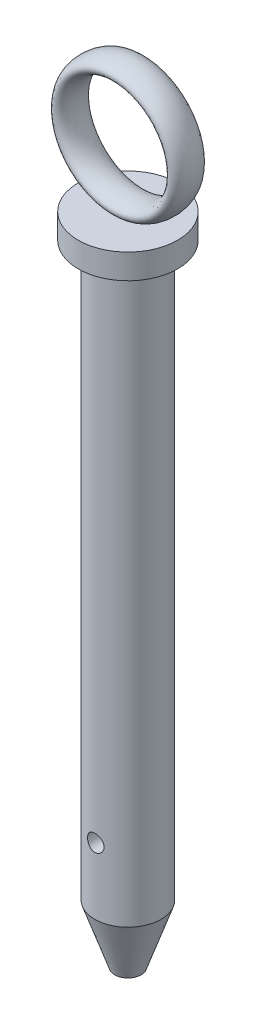
ISO-10303-21;
HEADER;
FILE_DESCRIPTION(('STEP AP214'),'2;1');
FILE_NAME('part.step','',(''),(''),'','','');
FILE_SCHEMA(('AUTOMOTIVE_DESIGN { 1 0 10303 214 1 1 1 1 }'));
ENDSEC;
DATA;
#1=APPLICATION_CONTEXT('core data for automotive mechanical design processes');
#2=APPLICATION_PROTOCOL_DEFINITION('international standard','automotive_design',2000,#1);
#3=PRODUCT_CONTEXT('',#1,'mechanical');
#4=PRODUCT('Part','Part','',(#3));
#5=PRODUCT_RELATED_PRODUCT_CATEGORY('part','',(#4));
#6=PRODUCT_DEFINITION_FORMATION('','',#4);
#7=PRODUCT_DEFINITION_CONTEXT('part definition',#1,'design');
#8=PRODUCT_DEFINITION('design','',#6,#7);
#9=PRODUCT_DEFINITION_SHAPE('','',#8);
#10=(LENGTH_UNIT() NAMED_UNIT(*) SI_UNIT(.MILLI.,.METRE.));
#11=(NAMED_UNIT(*) PLANE_ANGLE_UNIT() SI_UNIT($,.RADIAN.));
#12=(NAMED_UNIT(*) SI_UNIT($,.STERADIAN.) SOLID_ANGLE_UNIT());
#13=UNCERTAINTY_MEASURE_WITH_UNIT(LENGTH_MEASURE(1.E-05),#10,'distance_accuracy_value','');
#14=(GEOMETRIC_REPRESENTATION_CONTEXT(3) GLOBAL_UNCERTAINTY_ASSIGNED_CONTEXT((#13)) GLOBAL_UNIT_ASSIGNED_CONTEXT((#10,
#11,#12)) REPRESENTATION_CONTEXT('',''));
#15=CARTESIAN_POINT('',(0.,0.,0.));
#16=DIRECTION('',(0.,0.,1.));
#17=DIRECTION('',(1.,0.,0.));
#18=AXIS2_PLACEMENT_3D('',#15,#16,#17);
#19=CARTESIAN_POINT('',(34.9999999999985,435.,0.));
#20=DIRECTION('',(0.,1.,0.));
#21=DIRECTION('',(0.,0.,1.));
#22=AXIS2_PLACEMENT_3D('',#19,#20,#21);
#23=ELLIPSE('',#22,10.,5.);
#24=CARTESIAN_POINT('',(1.9726880990268E-12,435.,1000.));
#25=DIRECTION('',(0.,0.,1.));
#26=AXIS1_PLACEMENT('',#24,#25);
#27=SURFACE_OF_REVOLUTION('',#23,#26);
#28=ADVANCED_FACE('F39',(),#27,.F.);
#29=CLOSED_SHELL('',(#28));
#30=MANIFOLD_SOLID_BREP('B2',#29);
#31=CARTESIAN_POINT('',(-8.,0.,0.));
#32=DIRECTION('',(0.,1.,0.));
#33=DIRECTION('',(-1.,0.,0.));
#34=AXIS2_PLACEMENT_3D('',#31,#32,#33);
#35=PLANE('',#34);
#36=CARTESIAN_POINT('',(0.,0.,0.));
#37=DIRECTION('',(0.,-1.,0.));
#38=DIRECTION('',(1.,0.,0.));
#39=AXIS2_PLACEMENT_3D('',#36,#37,#38);
#40=CIRCLE('',#39,8.);
#41=CARTESIAN_POINT('',(8.,0.,0.));
#42=VERTEX_POINT('',#41);
#43=EDGE_CURVE('E103',#42,#42,#40,.T.);
#44=ORIENTED_EDGE('',*,*,#43,.T.);
#45=EDGE_LOOP('',(#44));
#46=FACE_BOUND('',#45,.T.);
#47=ADVANCED_FACE('F52',(#46),#35,.F.);
#48=CARTESIAN_POINT('',(0.,395.,0.));
#49=DIRECTION('',(0.,-1.,0.));
#50=DIRECTION('',(1.,0.,0.));
#51=AXIS2_PLACEMENT_3D('',#48,#49,#50);
#52=PLANE('',#51);
#53=CARTESIAN_POINT('',(-1.37913592763821E-12,395.,0.));
#54=DIRECTION('',(0.,-1.,0.));
#55=DIRECTION('',(1.,0.,0.));
#56=AXIS2_PLACEMENT_3D('',#53,#54,#55);
#57=CIRCLE('',#56,29.9999999999986);
#58=CARTESIAN_POINT('',(29.9999999999972,395.,0.));
#59=VERTEX_POINT('',#58);
#60=EDGE_CURVE('E38',#59,#59,#57,.T.);
#61=ORIENTED_EDGE('',*,*,#60,.F.);
#62=EDGE_LOOP('',(#61));
#63=FACE_BOUND('',#62,.T.);
#64=ADVANCED_FACE('F95',(#63),#52,.F.);
#65=CARTESIAN_POINT('',(3.49148336110938E-12,-1000.,0.));
#66=DIRECTION('',(0.,-1.,0.));
#67=DIRECTION('',(1.,0.,0.));
#68=AXIS2_PLACEMENT_3D('',#65,#66,#67);
#69=CYLINDRICAL_SURFACE('',#68,29.9999999999986);
#70=CARTESIAN_POINT('',(-1.32676367722156E-12,380.,0.));
#71=DIRECTION('',(0.,-1.,0.));
#72=DIRECTION('',(1.,0.,0.));
#73=AXIS2_PLACEMENT_3D('',#70,#71,#72);
#74=CIRCLE('',#73,29.9999999999987);
#75=CARTESIAN_POINT('',(29.9999999999973,380.,0.));
#76=VERTEX_POINT('',#75);
#77=EDGE_CURVE('E63',#76,#76,#74,.T.);
#78=ORIENTED_EDGE('',*,*,#77,.F.);
#79=EDGE_LOOP('',(#78));
#80=FACE_BOUND('',#79,.T.);
#81=ORIENTED_EDGE('',*,*,#60,.T.);
#82=EDGE_LOOP('',(#81));
#83=FACE_BOUND('',#82,.T.);
#84=ADVANCED_FACE('F100',(#80,#83),#69,.T.);
#85=CARTESIAN_POINT('',(-30.,380.,0.));
#86=DIRECTION('',(0.,1.,0.));
#87=DIRECTION('',(-1.,0.,0.));
#88=AXIS2_PLACEMENT_3D('',#85,#86,#87);
#89=PLANE('',#88);
#90=CARTESIAN_POINT('',(-1.32676367722156E-12,380.,0.));
#91=DIRECTION('',(0.,-1.,0.));
#92=DIRECTION('',(1.,0.,0.));
#93=AXIS2_PLACEMENT_3D('',#90,#91,#92);
#94=CIRCLE('',#93,19.9999999999987);
#95=CARTESIAN_POINT('',(19.9999999999973,380.,0.));
#96=VERTEX_POINT('',#95);
#97=EDGE_CURVE('E68',#96,#96,#94,.T.);
#98=ORIENTED_EDGE('',*,*,#97,.F.);
#99=EDGE_LOOP('',(#98));
#100=FACE_BOUND('',#99,.T.);
#101=ORIENTED_EDGE('',*,*,#77,.T.);
#102=EDGE_LOOP('',(#101));
#103=FACE_BOUND('',#102,.T.);
#104=ADVANCED_FACE('F90',(#100,#103),#89,.F.);
#105=CARTESIAN_POINT('',(3.49148336110938E-12,-1000.,0.));
#106=DIRECTION('',(0.,-1.,0.));
#107=DIRECTION('',(1.,0.,0.));
#108=AXIS2_PLACEMENT_3D('',#105,#106,#107);
#109=CYLINDRICAL_SURFACE('',#108,19.9999999999992);
#110=CARTESIAN_POINT('',(5.,74.9999999999997,-19.3649167310362));
#111=CARTESIAN_POINT('',(4.99999215718615,75.2761015018529,-19.3649220017564));
#112=CARTESIAN_POINT('',(4.97705249099531,75.5522897973568,-19.3708861202911));
#113=CARTESIAN_POINT('',(4.88604625092759,76.0967351563468,-19.3940372398504));
#114=CARTESIAN_POINT('',(4.81795341348421,76.3649875089361,-19.4112307724318));
#115=CARTESIAN_POINT('',(4.63898239926409,76.8856070763741,-19.4547744919222));
#116=CARTESIAN_POINT('',(4.528159455709,77.1379943107711,-19.4811128538083));
#117=CARTESIAN_POINT('',(4.26704228252279,77.6206217050795,-19.5399638405743));
#118=CARTESIAN_POINT('',(4.11674637712139,77.8508609241602,-19.5724767275689));
#119=CARTESIAN_POINT('',(3.77741685462378,78.2877232905242,-19.6408143271117));
#120=CARTESIAN_POINT('',(3.58767377540812,78.4937872006998,-19.6766919524599));
#121=CARTESIAN_POINT('',(3.17636412820134,78.8715227887204,-19.7472575103051));
#122=CARTESIAN_POINT('',(2.95479458836063,79.0431912512432,-19.781945331327));
#123=CARTESIAN_POINT('',(2.48229040215793,79.3495509352623,-19.8468083104109));
#124=CARTESIAN_POINT('',(2.23098915239026,79.4836927763227,-19.8769137480111));
#125=CARTESIAN_POINT('',(1.70852636858554,79.7076192883059,-19.9286162385189));
#126=CARTESIAN_POINT('',(1.4373677715839,79.7974105038307,-19.9502145466861));
#127=CARTESIAN_POINT('',(0.888717517508339,79.9282956691569,-19.9820951769628));
#128=CARTESIAN_POINT('',(0.611465439097967,79.9703392886529,-19.9925978768855));
#129=CARTESIAN_POINT('',(0.0536576385255505,80.0075167585508,-20.0018718821452));
#130=CARTESIAN_POINT('',(-0.22689758907613,80.0026575444189,-20.0006449219335));
#131=CARTESIAN_POINT('',(-0.77676123586192,79.9468502994995,-19.9867618990698));
#132=CARTESIAN_POINT('',(-1.0461810780053,79.8969273498921,-19.9743600468162));
#133=CARTESIAN_POINT('',(-1.57269123706844,79.7540574599027,-19.9398167304969));
#134=CARTESIAN_POINT('',(-1.82978089685225,79.6611082292448,-19.9176747479703));
#135=CARTESIAN_POINT('',(-2.32703351750895,79.4339948586258,-19.865750194015));
#136=CARTESIAN_POINT('',(-2.56702254883224,79.2994659106768,-19.835900393892));
#137=CARTESIAN_POINT('',(-3.0213781117027,78.9932886417667,-19.7717980762006));
#138=CARTESIAN_POINT('',(-3.23574017542852,78.8216338628764,-19.7375447930801));
#139=CARTESIAN_POINT('',(-3.63887017542373,78.4405825160372,-19.6672742753578));
#140=CARTESIAN_POINT('',(-3.82678839537206,78.2302902153124,-19.6312343903971));
#141=CARTESIAN_POINT('',(-4.164881879819,77.7808000529111,-19.5623008704539));
#142=CARTESIAN_POINT('',(-4.3150553802447,77.5416008409872,-19.5294073825689));
#143=CARTESIAN_POINT('',(-4.57394064510187,77.0394199317255,-19.4704099361791));
#144=CARTESIAN_POINT('',(-4.68244783480345,76.7763285394736,-19.44433967282));
#145=CARTESIAN_POINT('',(-4.85342810313207,76.2348290639496,-19.4023728014562));
#146=CARTESIAN_POINT('',(-4.91591103275196,75.9564242720622,-19.3864740164527));
#147=CARTESIAN_POINT('',(-4.99165927734366,75.4000809969178,-19.3671071205394));
#148=CARTESIAN_POINT('',(-5.00618094784141,75.1223244133118,-19.3633217796427));
#149=CARTESIAN_POINT('',(-4.98903398102716,74.5683561268352,-19.3677468671884));
#150=CARTESIAN_POINT('',(-4.95736959569877,74.2921442841024,-19.3759561913775));
#151=CARTESIAN_POINT('',(-4.84985092787734,73.7537714701011,-19.4031416397263));
#152=CARTESIAN_POINT('',(-4.77472813656404,73.4914545468609,-19.4219394048573));
#153=CARTESIAN_POINT('',(-4.58323616334071,72.9831370842935,-19.468014365248));
#154=CARTESIAN_POINT('',(-4.46686209542495,72.7371384818883,-19.4952925649255));
#155=CARTESIAN_POINT('',(-4.19354133587327,72.2631174442658,-19.5559227419115));
#156=CARTESIAN_POINT('',(-4.03584350767131,72.0355423199138,-19.5893833721447));
#157=CARTESIAN_POINT('',(-3.68530146467226,71.6096232743968,-19.658341661421));
#158=CARTESIAN_POINT('',(-3.49245147402721,71.4112841666995,-19.6938396545653));
#159=CARTESIAN_POINT('',(-3.07131360492366,71.0443779148579,-19.7639480606349));
#160=CARTESIAN_POINT('',(-2.84225976265799,70.8766798749021,-19.7985140412369));
#161=CARTESIAN_POINT('',(-2.35851341347339,70.5821282660972,-19.861944332273));
#162=CARTESIAN_POINT('',(-2.10382224478797,70.4552725667833,-19.8908089400782));
#163=CARTESIAN_POINT('',(-1.57779100865547,70.2471079309439,-19.9394023147658));
#164=CARTESIAN_POINT('',(-1.30658690513943,70.1654714312416,-19.9591966004475));
#165=CARTESIAN_POINT('',(-0.753748801594055,70.0490793307829,-19.987705867915));
#166=CARTESIAN_POINT('',(-0.472116825206222,70.0143146825217,-19.9964229878677));
#167=CARTESIAN_POINT('',(0.0854176322165942,69.993162052122,-20.0017084704396));
#168=CARTESIAN_POINT('',(0.361269134830085,70.0054914545227,-19.9985989439987));
#169=CARTESIAN_POINT('',(0.90683748207373,70.0752391364715,-19.9812948228714));
#170=CARTESIAN_POINT('',(1.17655450890462,70.1326560750656,-19.9671005578577));
#171=CARTESIAN_POINT('',(1.70085517822385,70.290261098854,-19.9292716426937));
#172=CARTESIAN_POINT('',(1.95551247290429,70.3902172665716,-19.9056882251188));
#173=CARTESIAN_POINT('',(2.44458526520809,70.6298528950976,-19.8515644456821));
#174=CARTESIAN_POINT('',(2.67899820632814,70.7695373633521,-19.8210232069371));
#175=CARTESIAN_POINT('',(3.1270096421165,71.0885761699804,-19.7553624840136));
#176=CARTESIAN_POINT('',(3.33997494149166,71.2688007145189,-19.7201508470824));
#177=CARTESIAN_POINT('',(3.7330751013675,71.6621142598865,-19.6495324528587));
#178=CARTESIAN_POINT('',(3.91320162538294,71.8752115805555,-19.6141256483643));
#179=CARTESIAN_POINT('',(4.23881013235914,72.333007070947,-19.5463737922743));
#180=CARTESIAN_POINT('',(4.38358309708188,72.578220616826,-19.5140981836636));
#181=CARTESIAN_POINT('',(4.62963448292733,73.0902774493738,-19.4571977747406));
#182=CARTESIAN_POINT('',(4.73094454876075,73.3571048304689,-19.4325674116598));
#183=CARTESIAN_POINT('',(4.87211264285501,73.8528850591755,-19.397595437536));
#184=CARTESIAN_POINT('',(4.91996585298439,74.0794658219304,-19.3854331501741));
#185=CARTESIAN_POINT('',(4.98391146285885,74.5373443449882,-19.3690919291302));
#186=CARTESIAN_POINT('',(5.00000657185875,74.7686417012217,-19.3649123144545));
#187=CARTESIAN_POINT('',(5.,74.9999999999997,-19.3649167310362));
#188=B_SPLINE_CURVE_WITH_KNOTS('',3,(#110,#111,#112,#113,#114,#115,#116,#117,#118,#119,#120,
#121,#122,#123,#124,#125,#126,#127,#128,#129,#130,#131,#132,#133,#134,#135,#136,#137,#138,#139,
#140,#141,#142,#143,#144,#145,#146,#147,#148,#149,#150,#151,#152,#153,#154,#155,#156,#157,#158,
#159,#160,#161,#162,#163,#164,#165,#166,#167,#168,#169,#170,#171,#172,#173,#174,#175,#176,#177,
#178,#179,#180,#181,#182,#183,#184,#185,#186,#187),.UNSPECIFIED.,.T.,.F.,(4,2,2,2,2,2,2,2,2,2,2,
2,2,2,2,2,2,2,2,2,2,2,2,2,2,2,2,2,2,2,2,2,2,2,2,2,2,2,4),(0.,0.827454883472284,1.65539148285733,
2.48226145433201,3.30916653510955,4.1524790838595,4.99587042959733,5.8510299279584,
6.70606319694184,7.54377501990693,8.38136297332042,9.20036525377894,10.0194111344957,
10.8458574850889,11.6724477093783,12.5214093314382,13.370410623996,14.2235286401916,
15.0764640026417,15.9068714953348,16.7372025438257,17.5539481003338,18.370790428578,
19.2036569173328,20.0366603778505,20.890506619456,21.7443083145407,22.5918414562882,
23.4392109783304,24.2636689226988,25.0881023476892,25.9080975313438,26.7281961149111,
27.567941931791,28.4079006314598,29.2635295458734,30.118534427551,30.8119565437652,
31.5053195022091),.UNSPECIFIED.);
#189=CARTESIAN_POINT('',(5.,74.9999999999997,-19.3649167310362));
#190=VERTEX_POINT('',#189);
#191=EDGE_CURVE('E55',#190,#190,#188,.T.);
#192=ORIENTED_EDGE('',*,*,#191,.T.);
#193=EDGE_LOOP('',(#192));
#194=FACE_BOUND('',#193,.T.);
#195=CARTESIAN_POINT('',(5.,74.9999999999997,19.3649167310362));
#196=CARTESIAN_POINT('',(4.99999215718615,74.7238984981466,19.3649220017564));
#197=CARTESIAN_POINT('',(4.9770524909953,74.4477102026427,19.3708861202911));
#198=CARTESIAN_POINT('',(4.88604625092759,73.9032648436527,19.3940372398504));
#199=CARTESIAN_POINT('',(4.81795341348421,73.6350124910634,19.4112307724318));
#200=CARTESIAN_POINT('',(4.63898239926409,73.1143929236254,19.4547744919222));
#201=CARTESIAN_POINT('',(4.52815945570898,72.8620056892283,19.4811128538083));
#202=CARTESIAN_POINT('',(4.26704228252277,72.37937829492,19.5399638405743));
#203=CARTESIAN_POINT('',(4.11674637712138,72.1491390758393,19.572476727569));
#204=CARTESIAN_POINT('',(3.77741685462377,71.7122767094753,19.6408143271117));
#205=CARTESIAN_POINT('',(3.5876737754081,71.5062127992996,19.6766919524599));
#206=CARTESIAN_POINT('',(3.17636412820133,71.1284772112791,19.7472575103051));
#207=CARTESIAN_POINT('',(2.95479458836062,70.9568087487562,19.781945331327));
#208=CARTESIAN_POINT('',(2.48229040215793,70.6504490647372,19.8468083104109));
#209=CARTESIAN_POINT('',(2.23098915239025,70.5163072236768,19.8769137480111));
#210=CARTESIAN_POINT('',(1.70852636858554,70.2923807116936,19.9286162385189));
#211=CARTESIAN_POINT('',(1.43736777158389,70.2025894961687,19.9502145466861));
#212=CARTESIAN_POINT('',(0.888717517508334,70.0717043308426,19.9820951769628));
#213=CARTESIAN_POINT('',(0.611465439097963,70.0296607113466,19.9925978768855));
#214=CARTESIAN_POINT('',(0.0536576385255475,69.9924832414486,20.0018718821452));
#215=CARTESIAN_POINT('',(-0.226897589076133,69.9973424555806,20.0006449219335));
#216=CARTESIAN_POINT('',(-0.776761235861921,70.0531497005,19.9867618990698));
#217=CARTESIAN_POINT('',(-1.0461810780053,70.1030726501074,19.9743600468161));
#218=CARTESIAN_POINT('',(-1.57269123706844,70.2459425400968,19.9398167304969));
#219=CARTESIAN_POINT('',(-1.82978089685225,70.3388917707547,19.9176747479703));
#220=CARTESIAN_POINT('',(-2.32703351750895,70.5660051413737,19.865750194015));
#221=CARTESIAN_POINT('',(-2.56702254883224,70.7005340893227,19.835900393892));
#222=CARTESIAN_POINT('',(-3.0213781117027,71.0067113582328,19.7717980762006));
#223=CARTESIAN_POINT('',(-3.23574017542852,71.1783661371231,19.7375447930801));
#224=CARTESIAN_POINT('',(-3.63887017542373,71.5594174839623,19.6672742753578));
#225=CARTESIAN_POINT('',(-3.82678839537206,71.7697097846871,19.6312343903971));
#226=CARTESIAN_POINT('',(-4.164881879819,72.2191999470884,19.5623008704539));
#227=CARTESIAN_POINT('',(-4.31505538024471,72.4583991590122,19.5294073825689));
#228=CARTESIAN_POINT('',(-4.57394064510187,72.9605800682739,19.470409936179));
#229=CARTESIAN_POINT('',(-4.68244783480345,73.2236714605259,19.44433967282));
#230=CARTESIAN_POINT('',(-4.85342810313207,73.7651709360499,19.4023728014562));
#231=CARTESIAN_POINT('',(-4.91591103275196,74.0435757279372,19.3864740164527));
#232=CARTESIAN_POINT('',(-4.99165927734366,74.5999190030817,19.3671071205394));
#233=CARTESIAN_POINT('',(-5.00618094784141,74.8776755866877,19.3633217796427));
#234=CARTESIAN_POINT('',(-4.98903398102716,75.4316438731643,19.3677468671884));
#235=CARTESIAN_POINT('',(-4.95736959569877,75.707855715897,19.3759561913775));
#236=CARTESIAN_POINT('',(-4.84985092787734,76.2462285298984,19.4031416397263));
#237=CARTESIAN_POINT('',(-4.77472813656404,76.5085454531385,19.4219394048573));
#238=CARTESIAN_POINT('',(-4.58323616334071,77.016862915706,19.468014365248));
#239=CARTESIAN_POINT('',(-4.46686209542495,77.2628615181112,19.4952925649255));
#240=CARTESIAN_POINT('',(-4.19354133587327,77.7368825557336,19.5559227419115));
#241=CARTESIAN_POINT('',(-4.0358435076713,77.9644576800857,19.5893833721447));
#242=CARTESIAN_POINT('',(-3.68530146467225,78.3903767256027,19.658341661421));
#243=CARTESIAN_POINT('',(-3.4924514740272,78.5887158332999,19.6938396545653));
#244=CARTESIAN_POINT('',(-3.07131360492365,78.9556220851416,19.7639480606349));
#245=CARTESIAN_POINT('',(-2.84225976265798,79.1233201250973,19.7985140412369));
#246=CARTESIAN_POINT('',(-2.35851341347339,79.4178717339022,19.861944332273));
#247=CARTESIAN_POINT('',(-2.10382224478797,79.5447274332161,19.8908089400782));
#248=CARTESIAN_POINT('',(-1.57779100865547,79.7528920690556,19.9394023147658));
#249=CARTESIAN_POINT('',(-1.30658690513943,79.8345285687579,19.9591966004475));
#250=CARTESIAN_POINT('',(-0.753748801594055,79.9509206692166,19.987705867915));
#251=CARTESIAN_POINT('',(-0.472116825206224,79.9856853174778,19.9964229878677));
#252=CARTESIAN_POINT('',(0.0854176322165911,80.0068379478774,20.0017084704396));
#253=CARTESIAN_POINT('',(0.361269134830082,79.9945085454768,19.9985989439987));
#254=CARTESIAN_POINT('',(0.906837482073726,79.924760863528,19.9812948228714));
#255=CARTESIAN_POINT('',(1.17655450890462,79.8673439249339,19.9671005578577));
#256=CARTESIAN_POINT('',(1.70085517822384,79.7097389011454,19.9292716426937));
#257=CARTESIAN_POINT('',(1.95551247290429,79.6097827334279,19.9056882251188));
#258=CARTESIAN_POINT('',(2.44458526520809,79.3701471049019,19.8515644456821));
#259=CARTESIAN_POINT('',(2.67899820632814,79.2304626366473,19.8210232069371));
#260=CARTESIAN_POINT('',(3.1270096421165,78.9114238300191,19.7553624840135));
#261=CARTESIAN_POINT('',(3.33997494149166,78.7311992854806,19.7201508470824));
#262=CARTESIAN_POINT('',(3.7330751013675,78.337885740113,19.6495324528587));
#263=CARTESIAN_POINT('',(3.91320162538294,78.124788419444,19.6141256483643));
#264=CARTESIAN_POINT('',(4.23881013235914,77.6669929290525,19.5463737922743));
#265=CARTESIAN_POINT('',(4.38358309708188,77.4217793831735,19.5140981836636));
#266=CARTESIAN_POINT('',(4.62963448292734,76.9097225506257,19.4571977747406));
#267=CARTESIAN_POINT('',(4.73094454876076,76.6428951695305,19.4325674116598));
#268=CARTESIAN_POINT('',(4.87211264285501,76.147114940824,19.397595437536));
#269=CARTESIAN_POINT('',(4.91996585298439,75.9205341780691,19.3854331501741));
#270=CARTESIAN_POINT('',(4.98391146285885,75.4626556550113,19.3690919291302));
#271=CARTESIAN_POINT('',(5.00000657185875,75.2313582987777,19.3649123144545));
#272=CARTESIAN_POINT('',(5.,74.9999999999997,19.3649167310362));
#273=B_SPLINE_CURVE_WITH_KNOTS('',3,(#195,#196,#197,#198,#199,#200,#201,#202,#203,#204,#205,
#206,#207,#208,#209,#210,#211,#212,#213,#214,#215,#216,#217,#218,#219,#220,#221,#222,#223,#224,
#225,#226,#227,#228,#229,#230,#231,#232,#233,#234,#235,#236,#237,#238,#239,#240,#241,#242,#243,
#244,#245,#246,#247,#248,#249,#250,#251,#252,#253,#254,#255,#256,#257,#258,#259,#260,#261,#262,
#263,#264,#265,#266,#267,#268,#269,#270,#271,#272),.UNSPECIFIED.,.T.,.F.,(4,2,2,2,2,2,2,2,2,2,2,
2,2,2,2,2,2,2,2,2,2,2,2,2,2,2,2,2,2,2,2,2,2,2,2,2,2,2,4),(0.,0.827454883472285,1.65539148285733,
2.48226145433204,3.30916653510957,4.15247908385953,4.99587042959733,5.8510299279584,
6.70606319694185,7.54377501990693,8.38136297332042,9.20036525377894,10.0194111344957,
10.8458574850889,11.6724477093783,12.5214093314382,13.370410623996,14.2235286401917,
15.0764640026417,15.9068714953348,16.7372025438257,17.5539481003338,18.370790428578,
19.2036569173328,20.0366603778505,20.890506619456,21.7443083145407,22.5918414562882,
23.4392109783304,24.2636689226988,25.0881023476893,25.9080975313438,26.7281961149111,
27.5679419317911,28.4079006314598,29.2635295458734,30.118534427551,30.8119565437653,
31.5053195022091),.UNSPECIFIED.);
#274=CARTESIAN_POINT('',(5.,74.9999999999997,19.3649167310362));
#275=VERTEX_POINT('',#274);
#276=EDGE_CURVE('E71',#275,#275,#273,.T.);
#277=ORIENTED_EDGE('',*,*,#276,.T.);
#278=EDGE_LOOP('',(#277));
#279=FACE_BOUND('',#278,.T.);
#280=CARTESIAN_POINT('',(-1.22201917638829E-13,35.0000000000001,0.));
#281=DIRECTION('',(0.,-1.,0.));
#282=DIRECTION('',(1.,0.,0.));
#283=AXIS2_PLACEMENT_3D('',#280,#281,#282);
#284=CIRCLE('',#283,19.9999999999998);
#285=CARTESIAN_POINT('',(19.9999999999997,35.0000000000002,0.));
#286=VERTEX_POINT('',#285);
#287=EDGE_CURVE('E104',#286,#286,#284,.T.);
#288=ORIENTED_EDGE('',*,*,#287,.F.);
#289=EDGE_LOOP('',(#288));
#290=FACE_BOUND('',#289,.T.);
#291=ORIENTED_EDGE('',*,*,#97,.T.);
#292=EDGE_LOOP('',(#291));
#293=FACE_BOUND('',#292,.T.);
#294=ADVANCED_FACE('F75',(#194,#279,#290,#293),#109,.T.);
#295=CARTESIAN_POINT('',(-1.22201917638829E-13,35.0000000000001,0.));
#296=DIRECTION('',(0.,1.,0.));
#297=DIRECTION('',(-1.,0.,0.));
#298=AXIS2_PLACEMENT_3D('',#295,#296,#297);
#299=CONICAL_SURFACE('',#298,19.9999999999998,0.330297354829248);
#300=ORIENTED_EDGE('',*,*,#43,.F.);
#301=EDGE_LOOP('',(#300));
#302=FACE_BOUND('',#301,.T.);
#303=ORIENTED_EDGE('',*,*,#287,.T.);
#304=EDGE_LOOP('',(#303));
#305=FACE_BOUND('',#304,.T.);
#306=ADVANCED_FACE('F82',(#302,#305),#299,.T.);
#307=CARTESIAN_POINT('',(0.,74.9999999999997,-29.9999999999987));
#308=DIRECTION('',(0.,0.,1.));
#309=DIRECTION('',(1.,0.,0.));
#310=AXIS2_PLACEMENT_3D('',#307,#308,#309);
#311=CYLINDRICAL_SURFACE('',#310,5.);
#312=ORIENTED_EDGE('',*,*,#276,.F.);
#313=EDGE_LOOP('',(#312));
#314=FACE_BOUND('',#313,.T.);
#315=ORIENTED_EDGE('',*,*,#191,.F.);
#316=EDGE_LOOP('',(#315));
#317=FACE_BOUND('',#316,.T.);
#318=ADVANCED_FACE('F79',(#314,#317),#311,.F.);
#319=CLOSED_SHELL('',(#47,#64,#84,#104,#294,#306,#318));
#320=MANIFOLD_SOLID_BREP('B6',#319);
#321=ADVANCED_BREP_SHAPE_REPRESENTATION('',(#18,#30,#320),#14);
#322=SHAPE_DEFINITION_REPRESENTATION(#9,#321);
ENDSEC;
END-ISO-10303-21;
